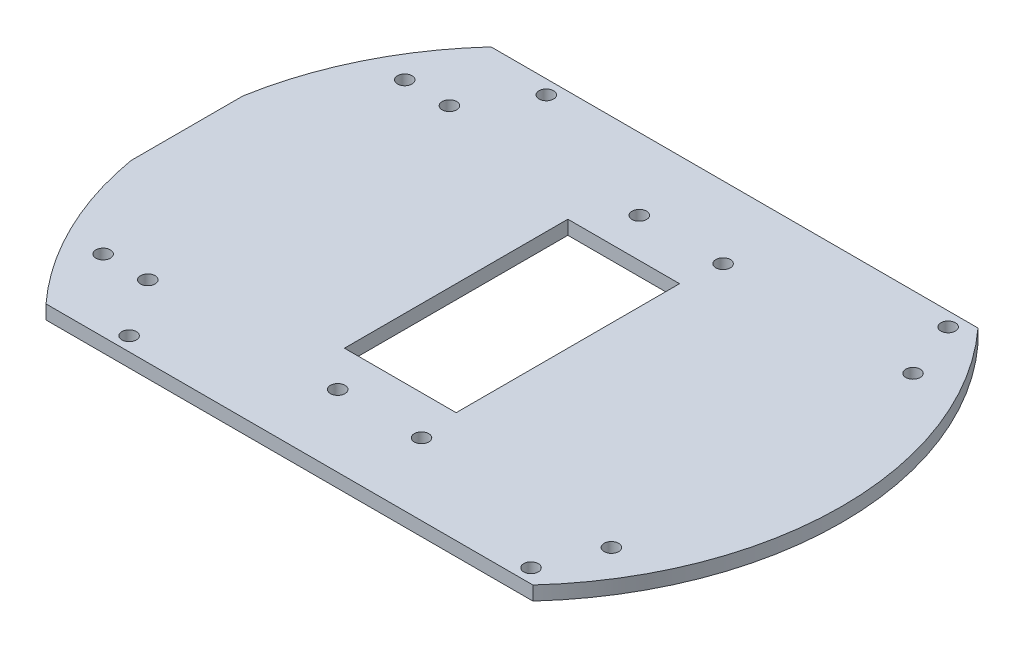
ISO-10303-21;
HEADER;
FILE_DESCRIPTION(('STEP AP214'),'2;1');
FILE_NAME('part.step','',(''),(''),'','','');
FILE_SCHEMA(('AUTOMOTIVE_DESIGN { 1 0 10303 214 1 1 1 1 }'));
ENDSEC;
DATA;
#1=APPLICATION_CONTEXT('core data for automotive mechanical design processes');
#2=APPLICATION_PROTOCOL_DEFINITION('international standard','automotive_design',2000,#1);
#3=PRODUCT_CONTEXT('',#1,'mechanical');
#4=PRODUCT('Part','Part','',(#3));
#5=PRODUCT_RELATED_PRODUCT_CATEGORY('part','',(#4));
#6=PRODUCT_DEFINITION_FORMATION('','',#4);
#7=PRODUCT_DEFINITION_CONTEXT('part definition',#1,'design');
#8=PRODUCT_DEFINITION('design','',#6,#7);
#9=PRODUCT_DEFINITION_SHAPE('','',#8);
#10=(LENGTH_UNIT() NAMED_UNIT(*) SI_UNIT(.MILLI.,.METRE.));
#11=(NAMED_UNIT(*) PLANE_ANGLE_UNIT() SI_UNIT($,.RADIAN.));
#12=(NAMED_UNIT(*) SI_UNIT($,.STERADIAN.) SOLID_ANGLE_UNIT());
#13=UNCERTAINTY_MEASURE_WITH_UNIT(LENGTH_MEASURE(1.E-05),#10,'distance_accuracy_value','');
#14=(GEOMETRIC_REPRESENTATION_CONTEXT(3) GLOBAL_UNCERTAINTY_ASSIGNED_CONTEXT((#13)) GLOBAL_UNIT_ASSIGNED_CONTEXT((#10,
#11,#12)) REPRESENTATION_CONTEXT('',''));
#15=CARTESIAN_POINT('',(0.,0.,0.));
#16=DIRECTION('',(0.,0.,1.));
#17=DIRECTION('',(1.,0.,0.));
#18=AXIS2_PLACEMENT_3D('',#15,#16,#17);
#19=CARTESIAN_POINT('',(0.,3.175,0.));
#20=DIRECTION('',(0.,1.,0.));
#21=DIRECTION('',(0.,0.,1.));
#22=AXIS2_PLACEMENT_3D('',#19,#20,#21);
#23=PLANE('',#22);
#24=CARTESIAN_POINT('',(56.8930871856786,3.175,34.29));
#25=DIRECTION('',(0.,1.,0.));
#26=DIRECTION('',(0.,0.,1.));
#27=AXIS2_PLACEMENT_3D('',#24,#25,#26);
#28=CIRCLE('',#27,1.651);
#29=CARTESIAN_POINT('',(56.8930871856786,3.175,35.941));
#30=VERTEX_POINT('',#29);
#31=EDGE_CURVE('E146',#30,#30,#28,.T.);
#32=ORIENTED_EDGE('',*,*,#31,.F.);
#33=EDGE_LOOP('',(#32));
#34=FACE_BOUND('',#33,.T.);
#35=CARTESIAN_POINT('',(56.8930871856786,3.175,-34.29));
#36=DIRECTION('',(0.,1.,0.));
#37=DIRECTION('',(0.,0.,1.));
#38=AXIS2_PLACEMENT_3D('',#35,#36,#37);
#39=CIRCLE('',#38,1.651);
#40=CARTESIAN_POINT('',(56.8930871856786,3.175,-32.639));
#41=VERTEX_POINT('',#40);
#42=EDGE_CURVE('E158',#41,#41,#39,.T.);
#43=ORIENTED_EDGE('',*,*,#42,.F.);
#44=EDGE_LOOP('',(#43));
#45=FACE_BOUND('',#44,.T.);
#46=CARTESIAN_POINT('',(-48.5169128143214,3.175,34.29));
#47=DIRECTION('',(0.,1.,0.));
#48=DIRECTION('',(0.,0.,1.));
#49=AXIS2_PLACEMENT_3D('',#46,#47,#48);
#50=CIRCLE('',#49,1.651);
#51=CARTESIAN_POINT('',(-48.5169128143214,3.175,35.941));
#52=VERTEX_POINT('',#51);
#53=EDGE_CURVE('E170',#52,#52,#50,.T.);
#54=ORIENTED_EDGE('',*,*,#53,.F.);
#55=EDGE_LOOP('',(#54));
#56=FACE_BOUND('',#55,.T.);
#57=CARTESIAN_POINT('',(-5.33691281432144,3.175,-34.29));
#58=DIRECTION('',(0.,1.,0.));
#59=DIRECTION('',(0.,0.,1.));
#60=AXIS2_PLACEMENT_3D('',#57,#58,#59);
#61=CIRCLE('',#60,1.651);
#62=CARTESIAN_POINT('',(-5.33691281432144,3.175,-32.639));
#63=VERTEX_POINT('',#62);
#64=EDGE_CURVE('E182',#63,#63,#61,.T.);
#65=ORIENTED_EDGE('',*,*,#64,.F.);
#66=EDGE_LOOP('',(#65));
#67=FACE_BOUND('',#66,.T.);
#68=CARTESIAN_POINT('',(51.7494062854116,3.175,47.4284618059944));
#69=DIRECTION('',(0.,1.,0.));
#70=DIRECTION('',(0.,0.,1.));
#71=AXIS2_PLACEMENT_3D('',#68,#69,#70);
#72=CIRCLE('',#71,1.651);
#73=CARTESIAN_POINT('',(51.7494062854116,3.175,49.0794618059944));
#74=VERTEX_POINT('',#73);
#75=EDGE_CURVE('E194',#74,#74,#72,.T.);
#76=ORIENTED_EDGE('',*,*,#75,.F.);
#77=EDGE_LOOP('',(#76));
#78=FACE_BOUND('',#77,.T.);
#79=CARTESIAN_POINT('',(51.7494062854116,3.175,-47.4284618059944));
#80=DIRECTION('',(0.,1.,0.));
#81=DIRECTION('',(0.,0.,1.));
#82=AXIS2_PLACEMENT_3D('',#79,#80,#81);
#83=CIRCLE('',#82,1.651);
#84=CARTESIAN_POINT('',(51.7494062854116,3.175,-45.7774618059944));
#85=VERTEX_POINT('',#84);
#86=EDGE_CURVE('E206',#85,#85,#83,.T.);
#87=ORIENTED_EDGE('',*,*,#86,.F.);
#88=EDGE_LOOP('',(#87));
#89=FACE_BOUND('',#88,.T.);
#90=CARTESIAN_POINT('',(-58.6769128143215,3.175,-34.29));
#91=DIRECTION('',(0.,1.,0.));
#92=DIRECTION('',(0.,0.,1.));
#93=AXIS2_PLACEMENT_3D('',#90,#91,#92);
#94=CIRCLE('',#93,1.651);
#95=CARTESIAN_POINT('',(-58.6769128143215,3.175,-32.639));
#96=VERTEX_POINT('',#95);
#97=EDGE_CURVE('E218',#96,#96,#94,.T.);
#98=ORIENTED_EDGE('',*,*,#97,.F.);
#99=EDGE_LOOP('',(#98));
#100=FACE_BOUND('',#99,.T.);
#101=CARTESIAN_POINT('',(0.,3.175,0.));
#102=DIRECTION('',(0.,1.,0.));
#103=DIRECTION('',(0.,0.,1.));
#104=AXIS2_PLACEMENT_3D('',#101,#102,#103);
#105=CIRCLE('',#104,75.);
#106=CARTESIAN_POINT('',(-55.3560263498858,3.175,-50.6034618059944));
#107=VERTEX_POINT('',#106);
#108=CARTESIAN_POINT('',(-73.9169128143214,3.175,-12.7000000000002));
#109=VERTEX_POINT('',#108);
#110=EDGE_CURVE('E230',#107,#109,#105,.T.);
#111=ORIENTED_EDGE('',*,*,#110,.T.);
#112=DIRECTION('',(0.,0.,1.));
#113=VECTOR('',#112,1.);
#114=CARTESIAN_POINT('',(-73.9169128143214,3.175,-12.7000000000002));
#115=LINE('',#114,#113);
#116=CARTESIAN_POINT('',(-73.9169128143214,3.175,12.7000000000002));
#117=VERTEX_POINT('',#116);
#118=EDGE_CURVE('E233',#109,#117,#115,.T.);
#119=ORIENTED_EDGE('',*,*,#118,.T.);
#120=CARTESIAN_POINT('',(0.,3.175,0.));
#121=DIRECTION('',(0.,1.,0.));
#122=DIRECTION('',(0.,0.,1.));
#123=AXIS2_PLACEMENT_3D('',#120,#121,#122);
#124=CIRCLE('',#123,75.);
#125=CARTESIAN_POINT('',(-55.3560263498859,3.175,50.6034618059944));
#126=VERTEX_POINT('',#125);
#127=EDGE_CURVE('E236',#117,#126,#124,.T.);
#128=ORIENTED_EDGE('',*,*,#127,.T.);
#129=DIRECTION('',(1.,0.,0.));
#130=VECTOR('',#129,1.);
#131=CARTESIAN_POINT('',(-55.3560263498859,3.175,50.6034618059944));
#132=LINE('',#131,#130);
#133=CARTESIAN_POINT('',(55.3560263498859,3.175,50.6034618059944));
#134=VERTEX_POINT('',#133);
#135=EDGE_CURVE('E238',#126,#134,#132,.T.);
#136=ORIENTED_EDGE('',*,*,#135,.T.);
#137=CARTESIAN_POINT('',(0.,3.175,0.));
#138=DIRECTION('',(0.,1.,0.));
#139=DIRECTION('',(0.,0.,1.));
#140=AXIS2_PLACEMENT_3D('',#137,#138,#139);
#141=CIRCLE('',#140,75.);
#142=CARTESIAN_POINT('',(55.3560263498859,3.175,-50.6034618059944));
#143=VERTEX_POINT('',#142);
#144=EDGE_CURVE('E240',#134,#143,#141,.T.);
#145=ORIENTED_EDGE('',*,*,#144,.T.);
#146=DIRECTION('',(-1.,0.,0.));
#147=VECTOR('',#146,1.);
#148=CARTESIAN_POINT('',(-55.3560263498858,3.175,-50.6034618059944));
#149=LINE('',#148,#147);
#150=EDGE_CURVE('E242',#143,#107,#149,.T.);
#151=ORIENTED_EDGE('',*,*,#150,.T.);
#152=EDGE_LOOP('',(#111,#119,#128,#136,#145,#151));
#153=FACE_BOUND('',#152,.T.);
#154=CARTESIAN_POINT('',(-58.6769128143215,3.175,34.29));
#155=DIRECTION('',(0.,1.,0.));
#156=DIRECTION('',(0.,0.,1.));
#157=AXIS2_PLACEMENT_3D('',#154,#155,#156);
#158=CIRCLE('',#157,1.651);
#159=CARTESIAN_POINT('',(-58.6769128143215,3.175,35.941));
#160=VERTEX_POINT('',#159);
#161=EDGE_CURVE('E224',#160,#160,#158,.T.);
#162=ORIENTED_EDGE('',*,*,#161,.F.);
#163=EDGE_LOOP('',(#162));
#164=FACE_BOUND('',#163,.T.);
#165=CARTESIAN_POINT('',(-39.6269128143215,3.175,-47.4284618059944));
#166=DIRECTION('',(0.,1.,0.));
#167=DIRECTION('',(0.,0.,1.));
#168=AXIS2_PLACEMENT_3D('',#165,#166,#167);
#169=CIRCLE('',#168,1.651);
#170=CARTESIAN_POINT('',(-39.6269128143215,3.175,-45.7774618059944));
#171=VERTEX_POINT('',#170);
#172=EDGE_CURVE('E212',#171,#171,#169,.T.);
#173=ORIENTED_EDGE('',*,*,#172,.F.);
#174=EDGE_LOOP('',(#173));
#175=FACE_BOUND('',#174,.T.);
#176=CARTESIAN_POINT('',(-39.6269128143215,3.175,47.4284618059944));
#177=DIRECTION('',(0.,1.,0.));
#178=DIRECTION('',(0.,0.,1.));
#179=AXIS2_PLACEMENT_3D('',#176,#177,#178);
#180=CIRCLE('',#179,1.651);
#181=CARTESIAN_POINT('',(-39.6269128143215,3.175,49.0794618059944));
#182=VERTEX_POINT('',#181);
#183=EDGE_CURVE('E200',#182,#182,#180,.T.);
#184=ORIENTED_EDGE('',*,*,#183,.F.);
#185=EDGE_LOOP('',(#184));
#186=FACE_BOUND('',#185,.T.);
#187=CARTESIAN_POINT('',(-48.5169128143214,3.175,-34.29));
#188=DIRECTION('',(0.,1.,0.));
#189=DIRECTION('',(0.,0.,1.));
#190=AXIS2_PLACEMENT_3D('',#187,#188,#189);
#191=CIRCLE('',#190,1.651);
#192=CARTESIAN_POINT('',(-48.5169128143214,3.175,-32.639));
#193=VERTEX_POINT('',#192);
#194=EDGE_CURVE('E188',#193,#193,#191,.T.);
#195=ORIENTED_EDGE('',*,*,#194,.F.);
#196=EDGE_LOOP('',(#195));
#197=FACE_BOUND('',#196,.T.);
#198=CARTESIAN_POINT('',(-5.33691281432144,3.175,34.29));
#199=DIRECTION('',(0.,1.,0.));
#200=DIRECTION('',(0.,0.,1.));
#201=AXIS2_PLACEMENT_3D('',#198,#199,#200);
#202=CIRCLE('',#201,1.651);
#203=CARTESIAN_POINT('',(-5.33691281432144,3.175,35.941));
#204=VERTEX_POINT('',#203);
#205=EDGE_CURVE('E176',#204,#204,#202,.T.);
#206=ORIENTED_EDGE('',*,*,#205,.F.);
#207=EDGE_LOOP('',(#206));
#208=FACE_BOUND('',#207,.T.);
#209=CARTESIAN_POINT('',(13.7130871856786,3.175,-34.29));
#210=DIRECTION('',(0.,1.,0.));
#211=DIRECTION('',(0.,0.,1.));
#212=AXIS2_PLACEMENT_3D('',#209,#210,#211);
#213=CIRCLE('',#212,1.651);
#214=CARTESIAN_POINT('',(13.7130871856786,3.175,-32.639));
#215=VERTEX_POINT('',#214);
#216=EDGE_CURVE('E164',#215,#215,#213,.T.);
#217=ORIENTED_EDGE('',*,*,#216,.F.);
#218=EDGE_LOOP('',(#217));
#219=FACE_BOUND('',#218,.T.);
#220=CARTESIAN_POINT('',(13.7130871856786,3.175,34.29));
#221=DIRECTION('',(0.,1.,0.));
#222=DIRECTION('',(0.,0.,1.));
#223=AXIS2_PLACEMENT_3D('',#220,#221,#222);
#224=CIRCLE('',#223,1.651);
#225=CARTESIAN_POINT('',(13.7130871856786,3.175,35.941));
#226=VERTEX_POINT('',#225);
#227=EDGE_CURVE('E152',#226,#226,#224,.T.);
#228=ORIENTED_EDGE('',*,*,#227,.F.);
#229=EDGE_LOOP('',(#228));
#230=FACE_BOUND('',#229,.T.);
#231=DIRECTION('',(1.,0.,0.));
#232=VECTOR('',#231,1.);
#233=CARTESIAN_POINT('',(-12.7,3.175,25.4));
#234=LINE('',#233,#232);
#235=CARTESIAN_POINT('',(-12.7,3.175,25.4));
#236=VERTEX_POINT('',#235);
#237=CARTESIAN_POINT('',(12.7,3.175,25.4));
#238=VERTEX_POINT('',#237);
#239=EDGE_CURVE('E118',#236,#238,#234,.T.);
#240=ORIENTED_EDGE('',*,*,#239,.F.);
#241=DIRECTION('',(0.,0.,1.));
#242=VECTOR('',#241,1.);
#243=CARTESIAN_POINT('',(-12.7,3.175,-25.4));
#244=LINE('',#243,#242);
#245=CARTESIAN_POINT('',(-12.7,3.175,-25.4));
#246=VERTEX_POINT('',#245);
#247=EDGE_CURVE('E110',#246,#236,#244,.T.);
#248=ORIENTED_EDGE('',*,*,#247,.F.);
#249=DIRECTION('',(-1.,0.,0.));
#250=VECTOR('',#249,1.);
#251=CARTESIAN_POINT('',(-12.7,3.175,-25.4));
#252=LINE('',#251,#250);
#253=CARTESIAN_POINT('',(12.7,3.175,-25.4));
#254=VERTEX_POINT('',#253);
#255=EDGE_CURVE('E132',#254,#246,#252,.T.);
#256=ORIENTED_EDGE('',*,*,#255,.F.);
#257=DIRECTION('',(0.,0.,-1.));
#258=VECTOR('',#257,1.);
#259=CARTESIAN_POINT('',(12.7,3.175,-25.4));
#260=LINE('',#259,#258);
#261=EDGE_CURVE('E130',#238,#254,#260,.T.);
#262=ORIENTED_EDGE('',*,*,#261,.F.);
#263=EDGE_LOOP('',(#240,#248,#256,#262));
#264=FACE_BOUND('',#263,.T.);
#265=ADVANCED_FACE('F33',(#34,#45,#56,#67,#78,#89,#100,#153,#164,#175,#186,#197,#208,#219,#230,
#264),#23,.T.);
#266=CARTESIAN_POINT('',(0.,0.,0.));
#267=DIRECTION('',(0.,1.,0.));
#268=DIRECTION('',(0.,0.,1.));
#269=AXIS2_PLACEMENT_3D('',#266,#267,#268);
#270=PLANE('',#269);
#271=CARTESIAN_POINT('',(56.8930871856786,0.,34.29));
#272=DIRECTION('',(0.,1.,0.));
#273=DIRECTION('',(0.,0.,1.));
#274=AXIS2_PLACEMENT_3D('',#271,#272,#273);
#275=CIRCLE('',#274,1.651);
#276=CARTESIAN_POINT('',(56.8930871856786,0.,35.941));
#277=VERTEX_POINT('',#276);
#278=EDGE_CURVE('E126',#277,#277,#275,.T.);
#279=ORIENTED_EDGE('',*,*,#278,.T.);
#280=EDGE_LOOP('',(#279));
#281=FACE_BOUND('',#280,.T.);
#282=CARTESIAN_POINT('',(56.8930871856786,0.,-34.29));
#283=DIRECTION('',(0.,1.,0.));
#284=DIRECTION('',(0.,0.,1.));
#285=AXIS2_PLACEMENT_3D('',#282,#283,#284);
#286=CIRCLE('',#285,1.651);
#287=CARTESIAN_POINT('',(56.8930871856786,0.,-32.639));
#288=VERTEX_POINT('',#287);
#289=EDGE_CURVE('E155',#288,#288,#286,.T.);
#290=ORIENTED_EDGE('',*,*,#289,.T.);
#291=EDGE_LOOP('',(#290));
#292=FACE_BOUND('',#291,.T.);
#293=CARTESIAN_POINT('',(-48.5169128143214,0.,34.29));
#294=DIRECTION('',(0.,1.,0.));
#295=DIRECTION('',(0.,0.,1.));
#296=AXIS2_PLACEMENT_3D('',#293,#294,#295);
#297=CIRCLE('',#296,1.651);
#298=CARTESIAN_POINT('',(-48.5169128143214,0.,35.941));
#299=VERTEX_POINT('',#298);
#300=EDGE_CURVE('E167',#299,#299,#297,.T.);
#301=ORIENTED_EDGE('',*,*,#300,.T.);
#302=EDGE_LOOP('',(#301));
#303=FACE_BOUND('',#302,.T.);
#304=CARTESIAN_POINT('',(-5.33691281432144,0.,-34.29));
#305=DIRECTION('',(0.,1.,0.));
#306=DIRECTION('',(0.,0.,1.));
#307=AXIS2_PLACEMENT_3D('',#304,#305,#306);
#308=CIRCLE('',#307,1.651);
#309=CARTESIAN_POINT('',(-5.33691281432144,0.,-32.639));
#310=VERTEX_POINT('',#309);
#311=EDGE_CURVE('E179',#310,#310,#308,.T.);
#312=ORIENTED_EDGE('',*,*,#311,.T.);
#313=EDGE_LOOP('',(#312));
#314=FACE_BOUND('',#313,.T.);
#315=CARTESIAN_POINT('',(51.7494062854116,0.,47.4284618059944));
#316=DIRECTION('',(0.,1.,0.));
#317=DIRECTION('',(0.,0.,1.));
#318=AXIS2_PLACEMENT_3D('',#315,#316,#317);
#319=CIRCLE('',#318,1.651);
#320=CARTESIAN_POINT('',(51.7494062854116,0.,49.0794618059944));
#321=VERTEX_POINT('',#320);
#322=EDGE_CURVE('E191',#321,#321,#319,.T.);
#323=ORIENTED_EDGE('',*,*,#322,.T.);
#324=EDGE_LOOP('',(#323));
#325=FACE_BOUND('',#324,.T.);
#326=CARTESIAN_POINT('',(51.7494062854116,0.,-47.4284618059944));
#327=DIRECTION('',(0.,1.,0.));
#328=DIRECTION('',(0.,0.,1.));
#329=AXIS2_PLACEMENT_3D('',#326,#327,#328);
#330=CIRCLE('',#329,1.651);
#331=CARTESIAN_POINT('',(51.7494062854116,0.,-45.7774618059944));
#332=VERTEX_POINT('',#331);
#333=EDGE_CURVE('E203',#332,#332,#330,.T.);
#334=ORIENTED_EDGE('',*,*,#333,.T.);
#335=EDGE_LOOP('',(#334));
#336=FACE_BOUND('',#335,.T.);
#337=CARTESIAN_POINT('',(-58.6769128143215,0.,-34.29));
#338=DIRECTION('',(0.,1.,0.));
#339=DIRECTION('',(0.,0.,1.));
#340=AXIS2_PLACEMENT_3D('',#337,#338,#339);
#341=CIRCLE('',#340,1.651);
#342=CARTESIAN_POINT('',(-58.6769128143215,0.,-32.639));
#343=VERTEX_POINT('',#342);
#344=EDGE_CURVE('E215',#343,#343,#341,.T.);
#345=ORIENTED_EDGE('',*,*,#344,.T.);
#346=EDGE_LOOP('',(#345));
#347=FACE_BOUND('',#346,.T.);
#348=CARTESIAN_POINT('',(0.,0.,0.));
#349=DIRECTION('',(0.,1.,0.));
#350=DIRECTION('',(0.,0.,1.));
#351=AXIS2_PLACEMENT_3D('',#348,#349,#350);
#352=CIRCLE('',#351,75.);
#353=CARTESIAN_POINT('',(-55.3560263498858,0.,-50.6034618059944));
#354=VERTEX_POINT('',#353);
#355=CARTESIAN_POINT('',(-73.9169128143214,0.,-12.7000000000002));
#356=VERTEX_POINT('',#355);
#357=EDGE_CURVE('E227',#354,#356,#352,.T.);
#358=ORIENTED_EDGE('',*,*,#357,.F.);
#359=DIRECTION('',(-1.,0.,0.));
#360=VECTOR('',#359,1.);
#361=CARTESIAN_POINT('',(-55.3560263498858,0.,-50.6034618059944));
#362=LINE('',#361,#360);
#363=CARTESIAN_POINT('',(55.3560263498859,0.,-50.6034618059944));
#364=VERTEX_POINT('',#363);
#365=EDGE_CURVE('E234',#364,#354,#362,.T.);
#366=ORIENTED_EDGE('',*,*,#365,.F.);
#367=CARTESIAN_POINT('',(0.,0.,0.));
#368=DIRECTION('',(0.,1.,0.));
#369=DIRECTION('',(0.,0.,1.));
#370=AXIS2_PLACEMENT_3D('',#367,#368,#369);
#371=CIRCLE('',#370,75.);
#372=CARTESIAN_POINT('',(55.3560263498859,0.,50.6034618059944));
#373=VERTEX_POINT('',#372);
#374=EDGE_CURVE('E253',#373,#364,#371,.T.);
#375=ORIENTED_EDGE('',*,*,#374,.F.);
#376=DIRECTION('',(1.,0.,0.));
#377=VECTOR('',#376,1.);
#378=CARTESIAN_POINT('',(-55.3560263498859,0.,50.6034618059944));
#379=LINE('',#378,#377);
#380=CARTESIAN_POINT('',(-55.3560263498859,0.,50.6034618059944));
#381=VERTEX_POINT('',#380);
#382=EDGE_CURVE('E251',#381,#373,#379,.T.);
#383=ORIENTED_EDGE('',*,*,#382,.F.);
#384=CARTESIAN_POINT('',(0.,0.,0.));
#385=DIRECTION('',(0.,1.,0.));
#386=DIRECTION('',(0.,0.,1.));
#387=AXIS2_PLACEMENT_3D('',#384,#385,#386);
#388=CIRCLE('',#387,75.);
#389=CARTESIAN_POINT('',(-73.9169128143214,0.,12.7000000000002));
#390=VERTEX_POINT('',#389);
#391=EDGE_CURVE('E249',#390,#381,#388,.T.);
#392=ORIENTED_EDGE('',*,*,#391,.F.);
#393=DIRECTION('',(0.,0.,1.));
#394=VECTOR('',#393,1.);
#395=CARTESIAN_POINT('',(-73.9169128143214,0.,-12.7000000000002));
#396=LINE('',#395,#394);
#397=EDGE_CURVE('E247',#356,#390,#396,.T.);
#398=ORIENTED_EDGE('',*,*,#397,.F.);
#399=EDGE_LOOP('',(#358,#366,#375,#383,#392,#398));
#400=FACE_BOUND('',#399,.T.);
#401=CARTESIAN_POINT('',(-58.6769128143215,0.,34.29));
#402=DIRECTION('',(0.,1.,0.));
#403=DIRECTION('',(0.,0.,1.));
#404=AXIS2_PLACEMENT_3D('',#401,#402,#403);
#405=CIRCLE('',#404,1.651);
#406=CARTESIAN_POINT('',(-58.6769128143215,0.,35.941));
#407=VERTEX_POINT('',#406);
#408=EDGE_CURVE('E221',#407,#407,#405,.T.);
#409=ORIENTED_EDGE('',*,*,#408,.T.);
#410=EDGE_LOOP('',(#409));
#411=FACE_BOUND('',#410,.T.);
#412=CARTESIAN_POINT('',(-39.6269128143215,0.,-47.4284618059944));
#413=DIRECTION('',(0.,1.,0.));
#414=DIRECTION('',(0.,0.,1.));
#415=AXIS2_PLACEMENT_3D('',#412,#413,#414);
#416=CIRCLE('',#415,1.651);
#417=CARTESIAN_POINT('',(-39.6269128143215,0.,-45.7774618059944));
#418=VERTEX_POINT('',#417);
#419=EDGE_CURVE('E209',#418,#418,#416,.T.);
#420=ORIENTED_EDGE('',*,*,#419,.T.);
#421=EDGE_LOOP('',(#420));
#422=FACE_BOUND('',#421,.T.);
#423=CARTESIAN_POINT('',(-39.6269128143215,0.,47.4284618059944));
#424=DIRECTION('',(0.,1.,0.));
#425=DIRECTION('',(0.,0.,1.));
#426=AXIS2_PLACEMENT_3D('',#423,#424,#425);
#427=CIRCLE('',#426,1.651);
#428=CARTESIAN_POINT('',(-39.6269128143215,0.,49.0794618059944));
#429=VERTEX_POINT('',#428);
#430=EDGE_CURVE('E197',#429,#429,#427,.T.);
#431=ORIENTED_EDGE('',*,*,#430,.T.);
#432=EDGE_LOOP('',(#431));
#433=FACE_BOUND('',#432,.T.);
#434=CARTESIAN_POINT('',(-48.5169128143214,0.,-34.29));
#435=DIRECTION('',(0.,1.,0.));
#436=DIRECTION('',(0.,0.,1.));
#437=AXIS2_PLACEMENT_3D('',#434,#435,#436);
#438=CIRCLE('',#437,1.651);
#439=CARTESIAN_POINT('',(-48.5169128143214,0.,-32.639));
#440=VERTEX_POINT('',#439);
#441=EDGE_CURVE('E185',#440,#440,#438,.T.);
#442=ORIENTED_EDGE('',*,*,#441,.T.);
#443=EDGE_LOOP('',(#442));
#444=FACE_BOUND('',#443,.T.);
#445=CARTESIAN_POINT('',(-5.33691281432144,0.,34.29));
#446=DIRECTION('',(0.,1.,0.));
#447=DIRECTION('',(0.,0.,1.));
#448=AXIS2_PLACEMENT_3D('',#445,#446,#447);
#449=CIRCLE('',#448,1.651);
#450=CARTESIAN_POINT('',(-5.33691281432144,0.,35.941));
#451=VERTEX_POINT('',#450);
#452=EDGE_CURVE('E173',#451,#451,#449,.T.);
#453=ORIENTED_EDGE('',*,*,#452,.T.);
#454=EDGE_LOOP('',(#453));
#455=FACE_BOUND('',#454,.T.);
#456=CARTESIAN_POINT('',(13.7130871856786,0.,-34.29));
#457=DIRECTION('',(0.,1.,0.));
#458=DIRECTION('',(0.,0.,1.));
#459=AXIS2_PLACEMENT_3D('',#456,#457,#458);
#460=CIRCLE('',#459,1.651);
#461=CARTESIAN_POINT('',(13.7130871856786,0.,-32.639));
#462=VERTEX_POINT('',#461);
#463=EDGE_CURVE('E161',#462,#462,#460,.T.);
#464=ORIENTED_EDGE('',*,*,#463,.T.);
#465=EDGE_LOOP('',(#464));
#466=FACE_BOUND('',#465,.T.);
#467=CARTESIAN_POINT('',(13.7130871856786,0.,34.29));
#468=DIRECTION('',(0.,1.,0.));
#469=DIRECTION('',(0.,0.,1.));
#470=AXIS2_PLACEMENT_3D('',#467,#468,#469);
#471=CIRCLE('',#470,1.651);
#472=CARTESIAN_POINT('',(13.7130871856786,0.,35.941));
#473=VERTEX_POINT('',#472);
#474=EDGE_CURVE('E149',#473,#473,#471,.T.);
#475=ORIENTED_EDGE('',*,*,#474,.T.);
#476=EDGE_LOOP('',(#475));
#477=FACE_BOUND('',#476,.T.);
#478=DIRECTION('',(0.,0.,1.));
#479=VECTOR('',#478,1.);
#480=CARTESIAN_POINT('',(-12.7,0.,-25.4));
#481=LINE('',#480,#479);
#482=CARTESIAN_POINT('',(-12.7,0.,-25.4));
#483=VERTEX_POINT('',#482);
#484=CARTESIAN_POINT('',(-12.7,0.,25.4));
#485=VERTEX_POINT('',#484);
#486=EDGE_CURVE('E56',#483,#485,#481,.T.);
#487=ORIENTED_EDGE('',*,*,#486,.T.);
#488=DIRECTION('',(1.,0.,0.));
#489=VECTOR('',#488,1.);
#490=CARTESIAN_POINT('',(-12.7,0.,25.4));
#491=LINE('',#490,#489);
#492=CARTESIAN_POINT('',(12.7,0.,25.4));
#493=VERTEX_POINT('',#492);
#494=EDGE_CURVE('E125',#485,#493,#491,.T.);
#495=ORIENTED_EDGE('',*,*,#494,.T.);
#496=DIRECTION('',(0.,0.,-1.));
#497=VECTOR('',#496,1.);
#498=CARTESIAN_POINT('',(12.7,0.,-25.4));
#499=LINE('',#498,#497);
#500=CARTESIAN_POINT('',(12.7,0.,-25.4));
#501=VERTEX_POINT('',#500);
#502=EDGE_CURVE('E138',#493,#501,#499,.T.);
#503=ORIENTED_EDGE('',*,*,#502,.T.);
#504=DIRECTION('',(-1.,0.,0.));
#505=VECTOR('',#504,1.);
#506=CARTESIAN_POINT('',(-12.7,0.,-25.4));
#507=LINE('',#506,#505);
#508=EDGE_CURVE('E119',#501,#483,#507,.T.);
#509=ORIENTED_EDGE('',*,*,#508,.T.);
#510=EDGE_LOOP('',(#487,#495,#503,#509));
#511=FACE_BOUND('',#510,.T.);
#512=ADVANCED_FACE('F277',(#281,#292,#303,#314,#325,#336,#347,#400,#411,#422,#433,#444,#455,
#466,#477,#511),#270,.F.);
#513=CARTESIAN_POINT('',(0.,3.175,0.));
#514=DIRECTION('',(0.,-1.,0.));
#515=DIRECTION('',(0.,0.,-1.));
#516=AXIS2_PLACEMENT_3D('',#513,#514,#515);
#517=CYLINDRICAL_SURFACE('',#516,75.);
#518=ORIENTED_EDGE('',*,*,#357,.T.);
#519=DIRECTION('',(0.,-1.,0.));
#520=VECTOR('',#519,1.);
#521=CARTESIAN_POINT('',(-73.9169128143214,3.175,-12.7000000000002));
#522=LINE('',#521,#520);
#523=EDGE_CURVE('E11',#109,#356,#522,.T.);
#524=ORIENTED_EDGE('',*,*,#523,.F.);
#525=ORIENTED_EDGE('',*,*,#110,.F.);
#526=DIRECTION('',(0.,-1.,0.));
#527=VECTOR('',#526,1.);
#528=CARTESIAN_POINT('',(-55.3560263498858,3.175,-50.6034618059944));
#529=LINE('',#528,#527);
#530=EDGE_CURVE('E244',#107,#354,#529,.T.);
#531=ORIENTED_EDGE('',*,*,#530,.T.);
#532=EDGE_LOOP('',(#518,#524,#525,#531));
#533=FACE_BOUND('',#532,.T.);
#534=ADVANCED_FACE('F35',(#533),#517,.T.);
#535=CARTESIAN_POINT('',(-73.9169128143214,3.175,-12.7000000000002));
#536=DIRECTION('',(1.,0.,0.));
#537=DIRECTION('',(0.,0.,-1.));
#538=AXIS2_PLACEMENT_3D('',#535,#536,#537);
#539=PLANE('',#538);
#540=ORIENTED_EDGE('',*,*,#397,.T.);
#541=DIRECTION('',(0.,-1.,0.));
#542=VECTOR('',#541,1.);
#543=CARTESIAN_POINT('',(-73.9169128143214,3.175,12.7000000000002));
#544=LINE('',#543,#542);
#545=EDGE_CURVE('E41',#117,#390,#544,.T.);
#546=ORIENTED_EDGE('',*,*,#545,.F.);
#547=ORIENTED_EDGE('',*,*,#118,.F.);
#548=ORIENTED_EDGE('',*,*,#523,.T.);
#549=EDGE_LOOP('',(#540,#546,#547,#548));
#550=FACE_BOUND('',#549,.T.);
#551=ADVANCED_FACE('F295',(#550),#539,.F.);
#552=CARTESIAN_POINT('',(0.,3.175,0.));
#553=DIRECTION('',(0.,-1.,0.));
#554=DIRECTION('',(0.,0.,-1.));
#555=AXIS2_PLACEMENT_3D('',#552,#553,#554);
#556=CYLINDRICAL_SURFACE('',#555,75.);
#557=ORIENTED_EDGE('',*,*,#391,.T.);
#558=DIRECTION('',(0.,-1.,0.));
#559=VECTOR('',#558,1.);
#560=CARTESIAN_POINT('',(-55.3560263498859,3.175,50.6034618059944));
#561=LINE('',#560,#559);
#562=EDGE_CURVE('E264',#126,#381,#561,.T.);
#563=ORIENTED_EDGE('',*,*,#562,.F.);
#564=ORIENTED_EDGE('',*,*,#127,.F.);
#565=ORIENTED_EDGE('',*,*,#545,.T.);
#566=EDGE_LOOP('',(#557,#563,#564,#565));
#567=FACE_BOUND('',#566,.T.);
#568=ADVANCED_FACE('F271',(#567),#556,.T.);
#569=CARTESIAN_POINT('',(-55.3560263498859,3.175,50.6034618059944));
#570=DIRECTION('',(0.,0.,-1.));
#571=DIRECTION('',(-1.,0.,0.));
#572=AXIS2_PLACEMENT_3D('',#569,#570,#571);
#573=PLANE('',#572);
#574=ORIENTED_EDGE('',*,*,#382,.T.);
#575=DIRECTION('',(0.,-1.,0.));
#576=VECTOR('',#575,1.);
#577=CARTESIAN_POINT('',(55.3560263498859,3.175,50.6034618059944));
#578=LINE('',#577,#576);
#579=EDGE_CURVE('E261',#134,#373,#578,.T.);
#580=ORIENTED_EDGE('',*,*,#579,.F.);
#581=ORIENTED_EDGE('',*,*,#135,.F.);
#582=ORIENTED_EDGE('',*,*,#562,.T.);
#583=EDGE_LOOP('',(#574,#580,#581,#582));
#584=FACE_BOUND('',#583,.T.);
#585=ADVANCED_FACE('F283',(#584),#573,.F.);
#586=CARTESIAN_POINT('',(0.,3.175,0.));
#587=DIRECTION('',(0.,-1.,0.));
#588=DIRECTION('',(0.,0.,-1.));
#589=AXIS2_PLACEMENT_3D('',#586,#587,#588);
#590=CYLINDRICAL_SURFACE('',#589,75.);
#591=ORIENTED_EDGE('',*,*,#374,.T.);
#592=DIRECTION('',(0.,-1.,0.));
#593=VECTOR('',#592,1.);
#594=CARTESIAN_POINT('',(55.3560263498859,3.175,-50.6034618059944));
#595=LINE('',#594,#593);
#596=EDGE_CURVE('E258',#143,#364,#595,.T.);
#597=ORIENTED_EDGE('',*,*,#596,.F.);
#598=ORIENTED_EDGE('',*,*,#144,.F.);
#599=ORIENTED_EDGE('',*,*,#579,.T.);
#600=EDGE_LOOP('',(#591,#597,#598,#599));
#601=FACE_BOUND('',#600,.T.);
#602=ADVANCED_FACE('F287',(#601),#590,.T.);
#603=CARTESIAN_POINT('',(-55.3560263498858,3.175,-50.6034618059944));
#604=DIRECTION('',(0.,0.,1.));
#605=DIRECTION('',(1.,0.,0.));
#606=AXIS2_PLACEMENT_3D('',#603,#604,#605);
#607=PLANE('',#606);
#608=ORIENTED_EDGE('',*,*,#365,.T.);
#609=ORIENTED_EDGE('',*,*,#530,.F.);
#610=ORIENTED_EDGE('',*,*,#150,.F.);
#611=ORIENTED_EDGE('',*,*,#596,.T.);
#612=EDGE_LOOP('',(#608,#609,#610,#611));
#613=FACE_BOUND('',#612,.T.);
#614=ADVANCED_FACE('F298',(#613),#607,.F.);
#615=CARTESIAN_POINT('',(-58.6769128143215,3.175,34.29));
#616=DIRECTION('',(0.,-1.,0.));
#617=DIRECTION('',(0.,0.,-1.));
#618=AXIS2_PLACEMENT_3D('',#615,#616,#617);
#619=CYLINDRICAL_SURFACE('',#618,1.651);
#620=ORIENTED_EDGE('',*,*,#161,.T.);
#621=EDGE_LOOP('',(#620));
#622=FACE_BOUND('',#621,.T.);
#623=ORIENTED_EDGE('',*,*,#408,.F.);
#624=EDGE_LOOP('',(#623));
#625=FACE_BOUND('',#624,.T.);
#626=ADVANCED_FACE('F300',(#622,#625),#619,.F.);
#627=CARTESIAN_POINT('',(-58.6769128143215,3.175,-34.29));
#628=DIRECTION('',(0.,-1.,0.));
#629=DIRECTION('',(0.,0.,-1.));
#630=AXIS2_PLACEMENT_3D('',#627,#628,#629);
#631=CYLINDRICAL_SURFACE('',#630,1.651);
#632=ORIENTED_EDGE('',*,*,#97,.T.);
#633=EDGE_LOOP('',(#632));
#634=FACE_BOUND('',#633,.T.);
#635=ORIENTED_EDGE('',*,*,#344,.F.);
#636=EDGE_LOOP('',(#635));
#637=FACE_BOUND('',#636,.T.);
#638=ADVANCED_FACE('F306',(#634,#637),#631,.F.);
#639=CARTESIAN_POINT('',(-39.6269128143215,3.175,-47.4284618059944));
#640=DIRECTION('',(0.,-1.,0.));
#641=DIRECTION('',(0.,0.,-1.));
#642=AXIS2_PLACEMENT_3D('',#639,#640,#641);
#643=CYLINDRICAL_SURFACE('',#642,1.651);
#644=ORIENTED_EDGE('',*,*,#172,.T.);
#645=EDGE_LOOP('',(#644));
#646=FACE_BOUND('',#645,.T.);
#647=ORIENTED_EDGE('',*,*,#419,.F.);
#648=EDGE_LOOP('',(#647));
#649=FACE_BOUND('',#648,.T.);
#650=ADVANCED_FACE('F323',(#646,#649),#643,.F.);
#651=CARTESIAN_POINT('',(51.7494062854116,3.175,-47.4284618059944));
#652=DIRECTION('',(0.,-1.,0.));
#653=DIRECTION('',(0.,0.,-1.));
#654=AXIS2_PLACEMENT_3D('',#651,#652,#653);
#655=CYLINDRICAL_SURFACE('',#654,1.651);
#656=ORIENTED_EDGE('',*,*,#86,.T.);
#657=EDGE_LOOP('',(#656));
#658=FACE_BOUND('',#657,.T.);
#659=ORIENTED_EDGE('',*,*,#333,.F.);
#660=EDGE_LOOP('',(#659));
#661=FACE_BOUND('',#660,.T.);
#662=ADVANCED_FACE('F327',(#658,#661),#655,.F.);
#663=CARTESIAN_POINT('',(-39.6269128143215,3.175,47.4284618059944));
#664=DIRECTION('',(0.,-1.,0.));
#665=DIRECTION('',(0.,0.,-1.));
#666=AXIS2_PLACEMENT_3D('',#663,#664,#665);
#667=CYLINDRICAL_SURFACE('',#666,1.651);
#668=ORIENTED_EDGE('',*,*,#183,.T.);
#669=EDGE_LOOP('',(#668));
#670=FACE_BOUND('',#669,.T.);
#671=ORIENTED_EDGE('',*,*,#430,.F.);
#672=EDGE_LOOP('',(#671));
#673=FACE_BOUND('',#672,.T.);
#674=ADVANCED_FACE('F331',(#670,#673),#667,.F.);
#675=CARTESIAN_POINT('',(51.7494062854116,3.175,47.4284618059944));
#676=DIRECTION('',(0.,-1.,0.));
#677=DIRECTION('',(0.,0.,-1.));
#678=AXIS2_PLACEMENT_3D('',#675,#676,#677);
#679=CYLINDRICAL_SURFACE('',#678,1.651);
#680=ORIENTED_EDGE('',*,*,#75,.T.);
#681=EDGE_LOOP('',(#680));
#682=FACE_BOUND('',#681,.T.);
#683=ORIENTED_EDGE('',*,*,#322,.F.);
#684=EDGE_LOOP('',(#683));
#685=FACE_BOUND('',#684,.T.);
#686=ADVANCED_FACE('F335',(#682,#685),#679,.F.);
#687=CARTESIAN_POINT('',(-48.5169128143214,3.175,-34.29));
#688=DIRECTION('',(0.,-1.,0.));
#689=DIRECTION('',(0.,0.,-1.));
#690=AXIS2_PLACEMENT_3D('',#687,#688,#689);
#691=CYLINDRICAL_SURFACE('',#690,1.651);
#692=ORIENTED_EDGE('',*,*,#194,.T.);
#693=EDGE_LOOP('',(#692));
#694=FACE_BOUND('',#693,.T.);
#695=ORIENTED_EDGE('',*,*,#441,.F.);
#696=EDGE_LOOP('',(#695));
#697=FACE_BOUND('',#696,.T.);
#698=ADVANCED_FACE('F339',(#694,#697),#691,.F.);
#699=CARTESIAN_POINT('',(-5.33691281432144,3.175,-34.29));
#700=DIRECTION('',(0.,-1.,0.));
#701=DIRECTION('',(0.,0.,-1.));
#702=AXIS2_PLACEMENT_3D('',#699,#700,#701);
#703=CYLINDRICAL_SURFACE('',#702,1.651);
#704=ORIENTED_EDGE('',*,*,#64,.T.);
#705=EDGE_LOOP('',(#704));
#706=FACE_BOUND('',#705,.T.);
#707=ORIENTED_EDGE('',*,*,#311,.F.);
#708=EDGE_LOOP('',(#707));
#709=FACE_BOUND('',#708,.T.);
#710=ADVANCED_FACE('F343',(#706,#709),#703,.F.);
#711=CARTESIAN_POINT('',(-5.33691281432144,3.175,34.29));
#712=DIRECTION('',(0.,-1.,0.));
#713=DIRECTION('',(0.,0.,-1.));
#714=AXIS2_PLACEMENT_3D('',#711,#712,#713);
#715=CYLINDRICAL_SURFACE('',#714,1.651);
#716=ORIENTED_EDGE('',*,*,#205,.T.);
#717=EDGE_LOOP('',(#716));
#718=FACE_BOUND('',#717,.T.);
#719=ORIENTED_EDGE('',*,*,#452,.F.);
#720=EDGE_LOOP('',(#719));
#721=FACE_BOUND('',#720,.T.);
#722=ADVANCED_FACE('F347',(#718,#721),#715,.F.);
#723=CARTESIAN_POINT('',(-48.5169128143214,3.175,34.29));
#724=DIRECTION('',(0.,-1.,0.));
#725=DIRECTION('',(0.,0.,-1.));
#726=AXIS2_PLACEMENT_3D('',#723,#724,#725);
#727=CYLINDRICAL_SURFACE('',#726,1.651);
#728=ORIENTED_EDGE('',*,*,#53,.T.);
#729=EDGE_LOOP('',(#728));
#730=FACE_BOUND('',#729,.T.);
#731=ORIENTED_EDGE('',*,*,#300,.F.);
#732=EDGE_LOOP('',(#731));
#733=FACE_BOUND('',#732,.T.);
#734=ADVANCED_FACE('F351',(#730,#733),#727,.F.);
#735=CARTESIAN_POINT('',(13.7130871856786,3.175,-34.29));
#736=DIRECTION('',(0.,-1.,0.));
#737=DIRECTION('',(0.,0.,-1.));
#738=AXIS2_PLACEMENT_3D('',#735,#736,#737);
#739=CYLINDRICAL_SURFACE('',#738,1.651);
#740=ORIENTED_EDGE('',*,*,#216,.T.);
#741=EDGE_LOOP('',(#740));
#742=FACE_BOUND('',#741,.T.);
#743=ORIENTED_EDGE('',*,*,#463,.F.);
#744=EDGE_LOOP('',(#743));
#745=FACE_BOUND('',#744,.T.);
#746=ADVANCED_FACE('F355',(#742,#745),#739,.F.);
#747=CARTESIAN_POINT('',(56.8930871856786,3.175,-34.29));
#748=DIRECTION('',(0.,-1.,0.));
#749=DIRECTION('',(0.,0.,-1.));
#750=AXIS2_PLACEMENT_3D('',#747,#748,#749);
#751=CYLINDRICAL_SURFACE('',#750,1.651);
#752=ORIENTED_EDGE('',*,*,#42,.T.);
#753=EDGE_LOOP('',(#752));
#754=FACE_BOUND('',#753,.T.);
#755=ORIENTED_EDGE('',*,*,#289,.F.);
#756=EDGE_LOOP('',(#755));
#757=FACE_BOUND('',#756,.T.);
#758=ADVANCED_FACE('F359',(#754,#757),#751,.F.);
#759=CARTESIAN_POINT('',(13.7130871856786,3.175,34.29));
#760=DIRECTION('',(0.,-1.,0.));
#761=DIRECTION('',(0.,0.,-1.));
#762=AXIS2_PLACEMENT_3D('',#759,#760,#761);
#763=CYLINDRICAL_SURFACE('',#762,1.651);
#764=ORIENTED_EDGE('',*,*,#227,.T.);
#765=EDGE_LOOP('',(#764));
#766=FACE_BOUND('',#765,.T.);
#767=ORIENTED_EDGE('',*,*,#474,.F.);
#768=EDGE_LOOP('',(#767));
#769=FACE_BOUND('',#768,.T.);
#770=ADVANCED_FACE('F363',(#766,#769),#763,.F.);
#771=CARTESIAN_POINT('',(56.8930871856786,3.175,34.29));
#772=DIRECTION('',(0.,-1.,0.));
#773=DIRECTION('',(0.,0.,-1.));
#774=AXIS2_PLACEMENT_3D('',#771,#772,#773);
#775=CYLINDRICAL_SURFACE('',#774,1.651);
#776=ORIENTED_EDGE('',*,*,#31,.T.);
#777=EDGE_LOOP('',(#776));
#778=FACE_BOUND('',#777,.T.);
#779=ORIENTED_EDGE('',*,*,#278,.F.);
#780=EDGE_LOOP('',(#779));
#781=FACE_BOUND('',#780,.T.);
#782=ADVANCED_FACE('F367',(#778,#781),#775,.F.);
#783=CARTESIAN_POINT('',(-12.7,3.175,-25.4));
#784=DIRECTION('',(1.,0.,0.));
#785=DIRECTION('',(0.,0.,-1.));
#786=AXIS2_PLACEMENT_3D('',#783,#784,#785);
#787=PLANE('',#786);
#788=ORIENTED_EDGE('',*,*,#486,.F.);
#789=DIRECTION('',(0.,-1.,0.));
#790=VECTOR('',#789,1.);
#791=CARTESIAN_POINT('',(-12.7,3.175,-25.4));
#792=LINE('',#791,#790);
#793=EDGE_CURVE('E114',#246,#483,#792,.T.);
#794=ORIENTED_EDGE('',*,*,#793,.F.);
#795=ORIENTED_EDGE('',*,*,#247,.T.);
#796=DIRECTION('',(0.,-1.,0.));
#797=VECTOR('',#796,1.);
#798=CARTESIAN_POINT('',(-12.7,3.175,25.4));
#799=LINE('',#798,#797);
#800=EDGE_CURVE('E113',#236,#485,#799,.T.);
#801=ORIENTED_EDGE('',*,*,#800,.T.);
#802=EDGE_LOOP('',(#788,#794,#795,#801));
#803=FACE_BOUND('',#802,.T.);
#804=ADVANCED_FACE('F112',(#803),#787,.T.);
#805=CARTESIAN_POINT('',(-12.7,3.175,25.4));
#806=DIRECTION('',(0.,0.,-1.));
#807=DIRECTION('',(-1.,0.,0.));
#808=AXIS2_PLACEMENT_3D('',#805,#806,#807);
#809=PLANE('',#808);
#810=ORIENTED_EDGE('',*,*,#494,.F.);
#811=ORIENTED_EDGE('',*,*,#800,.F.);
#812=ORIENTED_EDGE('',*,*,#239,.T.);
#813=DIRECTION('',(0.,-1.,0.));
#814=VECTOR('',#813,1.);
#815=CARTESIAN_POINT('',(12.7,3.175,25.4));
#816=LINE('',#815,#814);
#817=EDGE_CURVE('E127',#238,#493,#816,.T.);
#818=ORIENTED_EDGE('',*,*,#817,.T.);
#819=EDGE_LOOP('',(#810,#811,#812,#818));
#820=FACE_BOUND('',#819,.T.);
#821=ADVANCED_FACE('F122',(#820),#809,.T.);
#822=CARTESIAN_POINT('',(12.7,3.175,-25.4));
#823=DIRECTION('',(-1.,0.,0.));
#824=DIRECTION('',(0.,0.,1.));
#825=AXIS2_PLACEMENT_3D('',#822,#823,#824);
#826=PLANE('',#825);
#827=ORIENTED_EDGE('',*,*,#502,.F.);
#828=ORIENTED_EDGE('',*,*,#817,.F.);
#829=ORIENTED_EDGE('',*,*,#261,.T.);
#830=DIRECTION('',(0.,-1.,0.));
#831=VECTOR('',#830,1.);
#832=CARTESIAN_POINT('',(12.7,3.175,-25.4));
#833=LINE('',#832,#831);
#834=EDGE_CURVE('E48',#254,#501,#833,.T.);
#835=ORIENTED_EDGE('',*,*,#834,.T.);
#836=EDGE_LOOP('',(#827,#828,#829,#835));
#837=FACE_BOUND('',#836,.T.);
#838=ADVANCED_FACE('F376',(#837),#826,.T.);
#839=CARTESIAN_POINT('',(-12.7,3.175,-25.4));
#840=DIRECTION('',(0.,0.,1.));
#841=DIRECTION('',(1.,0.,0.));
#842=AXIS2_PLACEMENT_3D('',#839,#840,#841);
#843=PLANE('',#842);
#844=ORIENTED_EDGE('',*,*,#508,.F.);
#845=ORIENTED_EDGE('',*,*,#834,.F.);
#846=ORIENTED_EDGE('',*,*,#255,.T.);
#847=ORIENTED_EDGE('',*,*,#793,.T.);
#848=EDGE_LOOP('',(#844,#845,#846,#847));
#849=FACE_BOUND('',#848,.T.);
#850=ADVANCED_FACE('F379',(#849),#843,.T.);
#851=CLOSED_SHELL('',(#265,#512,#534,#551,#568,#585,#602,#614,#626,#638,#650,#662,#674,#686,
#698,#710,#722,#734,#746,#758,#770,#782,#804,#821,#838,#850));
#852=MANIFOLD_SOLID_BREP('B2',#851);
#853=ADVANCED_BREP_SHAPE_REPRESENTATION('',(#18,#852),#14);
#854=SHAPE_DEFINITION_REPRESENTATION(#9,#853);
ENDSEC;
END-ISO-10303-21;
